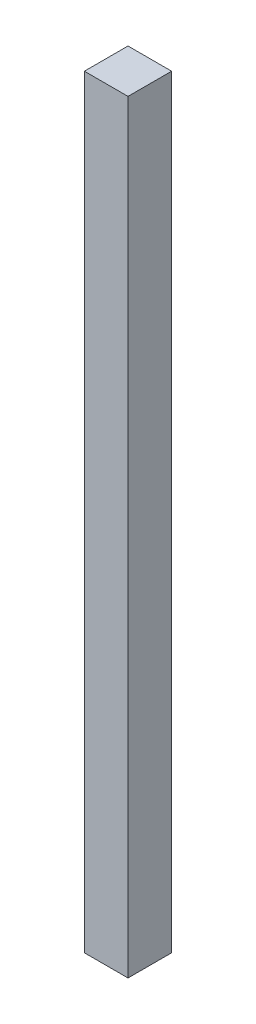
ISO-10303-21;
HEADER;
FILE_DESCRIPTION(('STEP AP214'),'2;1');
FILE_NAME('part.step','',(''),(''),'','','');
FILE_SCHEMA(('AUTOMOTIVE_DESIGN { 1 0 10303 214 1 1 1 1 }'));
ENDSEC;
DATA;
#1=APPLICATION_CONTEXT('core data for automotive mechanical design processes');
#2=APPLICATION_PROTOCOL_DEFINITION('international standard','automotive_design',2000,#1);
#3=PRODUCT_CONTEXT('',#1,'mechanical');
#4=PRODUCT('Part','Part','',(#3));
#5=PRODUCT_RELATED_PRODUCT_CATEGORY('part','',(#4));
#6=PRODUCT_DEFINITION_FORMATION('','',#4);
#7=PRODUCT_DEFINITION_CONTEXT('part definition',#1,'design');
#8=PRODUCT_DEFINITION('design','',#6,#7);
#9=PRODUCT_DEFINITION_SHAPE('','',#8);
#10=(LENGTH_UNIT() NAMED_UNIT(*) SI_UNIT(.MILLI.,.METRE.));
#11=(NAMED_UNIT(*) PLANE_ANGLE_UNIT() SI_UNIT($,.RADIAN.));
#12=(NAMED_UNIT(*) SI_UNIT($,.STERADIAN.) SOLID_ANGLE_UNIT());
#13=UNCERTAINTY_MEASURE_WITH_UNIT(LENGTH_MEASURE(1.E-05),#10,'distance_accuracy_value','');
#14=(GEOMETRIC_REPRESENTATION_CONTEXT(3) GLOBAL_UNCERTAINTY_ASSIGNED_CONTEXT((#13)) GLOBAL_UNIT_ASSIGNED_CONTEXT((#10,
#11,#12)) REPRESENTATION_CONTEXT('',''));
#15=CARTESIAN_POINT('',(0.,0.,0.));
#16=DIRECTION('',(0.,0.,1.));
#17=DIRECTION('',(1.,0.,0.));
#18=AXIS2_PLACEMENT_3D('',#15,#16,#17);
#19=CARTESIAN_POINT('',(0.,350.,0.));
#20=DIRECTION('',(-1.,0.,0.));
#21=DIRECTION('',(0.,0.,1.));
#22=AXIS2_PLACEMENT_3D('',#19,#20,#21);
#23=PLANE('',#22);
#24=DIRECTION('',(0.,0.,-1.));
#25=VECTOR('',#24,1.);
#26=CARTESIAN_POINT('',(0.,0.,0.));
#27=LINE('',#26,#25);
#28=CARTESIAN_POINT('',(0.,0.,0.));
#29=VERTEX_POINT('',#28);
#30=CARTESIAN_POINT('',(0.,0.,-20.));
#31=VERTEX_POINT('',#30);
#32=EDGE_CURVE('E104',#29,#31,#27,.T.);
#33=ORIENTED_EDGE('',*,*,#32,.F.);
#34=DIRECTION('',(0.,-1.,0.));
#35=VECTOR('',#34,1.);
#36=CARTESIAN_POINT('',(0.,350.,0.));
#37=LINE('',#36,#35);
#38=CARTESIAN_POINT('',(0.,350.,0.));
#39=VERTEX_POINT('',#38);
#40=EDGE_CURVE('E11',#39,#29,#37,.T.);
#41=ORIENTED_EDGE('',*,*,#40,.F.);
#42=DIRECTION('',(0.,0.,-1.));
#43=VECTOR('',#42,1.);
#44=CARTESIAN_POINT('',(0.,350.,0.));
#45=LINE('',#44,#43);
#46=CARTESIAN_POINT('',(0.,350.,-20.));
#47=VERTEX_POINT('',#46);
#48=EDGE_CURVE('E99',#39,#47,#45,.T.);
#49=ORIENTED_EDGE('',*,*,#48,.T.);
#50=DIRECTION('',(0.,-1.,0.));
#51=VECTOR('',#50,1.);
#52=CARTESIAN_POINT('',(0.,350.,-20.));
#53=LINE('',#52,#51);
#54=EDGE_CURVE('E42',#47,#31,#53,.T.);
#55=ORIENTED_EDGE('',*,*,#54,.T.);
#56=EDGE_LOOP('',(#33,#41,#49,#55));
#57=FACE_BOUND('',#56,.T.);
#58=ADVANCED_FACE('F39',(#57),#23,.T.);
#59=CARTESIAN_POINT('',(0.,350.,0.));
#60=DIRECTION('',(0.,0.,-1.));
#61=DIRECTION('',(-1.,0.,0.));
#62=AXIS2_PLACEMENT_3D('',#59,#60,#61);
#63=PLANE('',#62);
#64=DIRECTION('',(1.,0.,0.));
#65=VECTOR('',#64,1.);
#66=CARTESIAN_POINT('',(0.,0.,0.));
#67=LINE('',#66,#65);
#68=CARTESIAN_POINT('',(20.,0.,0.));
#69=VERTEX_POINT('',#68);
#70=EDGE_CURVE('E72',#29,#69,#67,.T.);
#71=ORIENTED_EDGE('',*,*,#70,.T.);
#72=DIRECTION('',(0.,-1.,0.));
#73=VECTOR('',#72,1.);
#74=CARTESIAN_POINT('',(20.,350.,0.));
#75=LINE('',#74,#73);
#76=CARTESIAN_POINT('',(20.,350.,0.));
#77=VERTEX_POINT('',#76);
#78=EDGE_CURVE('E48',#77,#69,#75,.T.);
#79=ORIENTED_EDGE('',*,*,#78,.F.);
#80=DIRECTION('',(1.,0.,0.));
#81=VECTOR('',#80,1.);
#82=CARTESIAN_POINT('',(0.,350.,0.));
#83=LINE('',#82,#81);
#84=EDGE_CURVE('E89',#39,#77,#83,.T.);
#85=ORIENTED_EDGE('',*,*,#84,.F.);
#86=ORIENTED_EDGE('',*,*,#40,.T.);
#87=EDGE_LOOP('',(#71,#79,#85,#86));
#88=FACE_BOUND('',#87,.T.);
#89=ADVANCED_FACE('F114',(#88),#63,.F.);
#90=CARTESIAN_POINT('',(20.,350.,0.));
#91=DIRECTION('',(-1.,0.,0.));
#92=DIRECTION('',(0.,0.,1.));
#93=AXIS2_PLACEMENT_3D('',#90,#91,#92);
#94=PLANE('',#93);
#95=DIRECTION('',(0.,0.,-1.));
#96=VECTOR('',#95,1.);
#97=CARTESIAN_POINT('',(20.,0.,0.));
#98=LINE('',#97,#96);
#99=CARTESIAN_POINT('',(20.,0.,-20.));
#100=VERTEX_POINT('',#99);
#101=EDGE_CURVE('E96',#69,#100,#98,.T.);
#102=ORIENTED_EDGE('',*,*,#101,.T.);
#103=DIRECTION('',(0.,-1.,0.));
#104=VECTOR('',#103,1.);
#105=CARTESIAN_POINT('',(20.,350.,-20.));
#106=LINE('',#105,#104);
#107=CARTESIAN_POINT('',(20.,350.,-20.));
#108=VERTEX_POINT('',#107);
#109=EDGE_CURVE('E93',#108,#100,#106,.T.);
#110=ORIENTED_EDGE('',*,*,#109,.F.);
#111=DIRECTION('',(0.,0.,-1.));
#112=VECTOR('',#111,1.);
#113=CARTESIAN_POINT('',(20.,350.,0.));
#114=LINE('',#113,#112);
#115=EDGE_CURVE('E84',#77,#108,#114,.T.);
#116=ORIENTED_EDGE('',*,*,#115,.F.);
#117=ORIENTED_EDGE('',*,*,#78,.T.);
#118=EDGE_LOOP('',(#102,#110,#116,#117));
#119=FACE_BOUND('',#118,.T.);
#120=ADVANCED_FACE('F94',(#119),#94,.F.);
#121=CARTESIAN_POINT('',(0.,350.,-20.));
#122=DIRECTION('',(0.,0.,-1.));
#123=DIRECTION('',(-1.,0.,0.));
#124=AXIS2_PLACEMENT_3D('',#121,#122,#123);
#125=PLANE('',#124);
#126=DIRECTION('',(1.,0.,0.));
#127=VECTOR('',#126,1.);
#128=CARTESIAN_POINT('',(0.,0.,-20.));
#129=LINE('',#128,#127);
#130=EDGE_CURVE('E107',#31,#100,#129,.T.);
#131=ORIENTED_EDGE('',*,*,#130,.F.);
#132=ORIENTED_EDGE('',*,*,#54,.F.);
#133=DIRECTION('',(1.,0.,0.));
#134=VECTOR('',#133,1.);
#135=CARTESIAN_POINT('',(0.,350.,-20.));
#136=LINE('',#135,#134);
#137=EDGE_CURVE('E88',#47,#108,#136,.T.);
#138=ORIENTED_EDGE('',*,*,#137,.T.);
#139=ORIENTED_EDGE('',*,*,#109,.T.);
#140=EDGE_LOOP('',(#131,#132,#138,#139));
#141=FACE_BOUND('',#140,.T.);
#142=ADVANCED_FACE('F98',(#141),#125,.T.);
#143=CARTESIAN_POINT('',(0.,350.,0.));
#144=DIRECTION('',(0.,-1.,0.));
#145=DIRECTION('',(0.,0.,-1.));
#146=AXIS2_PLACEMENT_3D('',#143,#144,#145);
#147=PLANE('',#146);
#148=ORIENTED_EDGE('',*,*,#48,.F.);
#149=ORIENTED_EDGE('',*,*,#84,.T.);
#150=ORIENTED_EDGE('',*,*,#115,.T.);
#151=ORIENTED_EDGE('',*,*,#137,.F.);
#152=EDGE_LOOP('',(#148,#149,#150,#151));
#153=FACE_BOUND('',#152,.T.);
#154=ADVANCED_FACE('F87',(#153),#147,.F.);
#155=CARTESIAN_POINT('',(0.,0.,0.));
#156=DIRECTION('',(0.,-1.,0.));
#157=DIRECTION('',(0.,0.,-1.));
#158=AXIS2_PLACEMENT_3D('',#155,#156,#157);
#159=PLANE('',#158);
#160=ORIENTED_EDGE('',*,*,#32,.T.);
#161=ORIENTED_EDGE('',*,*,#130,.T.);
#162=ORIENTED_EDGE('',*,*,#101,.F.);
#163=ORIENTED_EDGE('',*,*,#70,.F.);
#164=EDGE_LOOP('',(#160,#161,#162,#163));
#165=FACE_BOUND('',#164,.T.);
#166=ADVANCED_FACE('F112',(#165),#159,.T.);
#167=CLOSED_SHELL('',(#58,#89,#120,#142,#154,#166));
#168=MANIFOLD_SOLID_BREP('B2',#167);
#169=ADVANCED_BREP_SHAPE_REPRESENTATION('',(#18,#168),#14);
#170=SHAPE_DEFINITION_REPRESENTATION(#9,#169);
ENDSEC;
END-ISO-10303-21;
